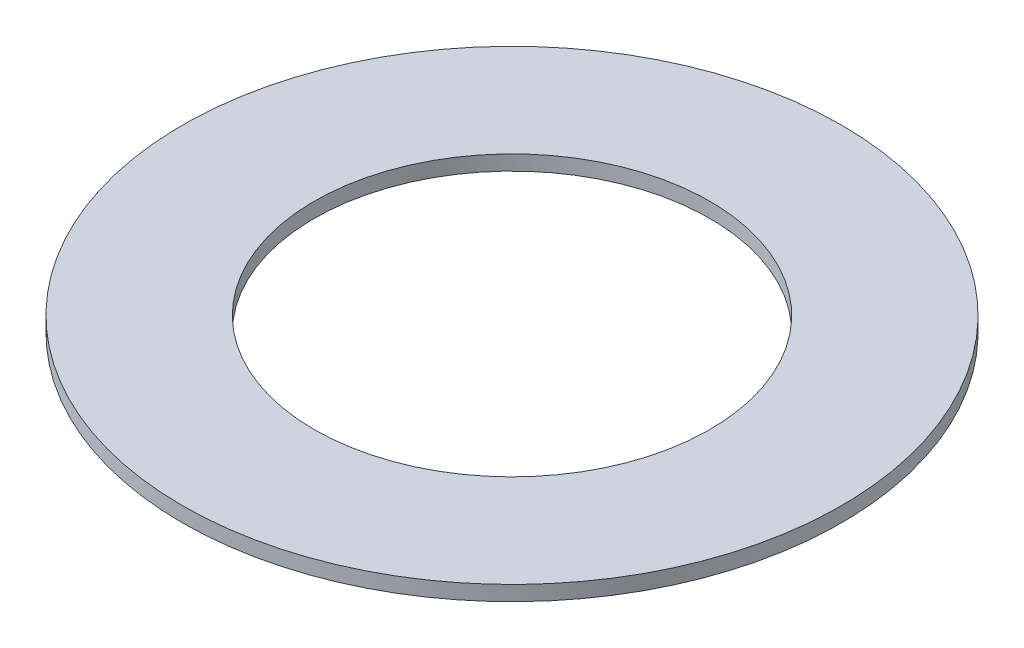
ISO-10303-21;
HEADER;
FILE_DESCRIPTION(('STEP AP214'),'2;1');
FILE_NAME('part.step','',(''),(''),'','','');
FILE_SCHEMA(('AUTOMOTIVE_DESIGN { 1 0 10303 214 1 1 1 1 }'));
ENDSEC;
DATA;
#1=APPLICATION_CONTEXT('core data for automotive mechanical design processes');
#2=APPLICATION_PROTOCOL_DEFINITION('international standard','automotive_design',2000,#1);
#3=PRODUCT_CONTEXT('',#1,'mechanical');
#4=PRODUCT('Part','Part','',(#3));
#5=PRODUCT_RELATED_PRODUCT_CATEGORY('part','',(#4));
#6=PRODUCT_DEFINITION_FORMATION('','',#4);
#7=PRODUCT_DEFINITION_CONTEXT('part definition',#1,'design');
#8=PRODUCT_DEFINITION('design','',#6,#7);
#9=PRODUCT_DEFINITION_SHAPE('','',#8);
#10=(LENGTH_UNIT() NAMED_UNIT(*) SI_UNIT(.MILLI.,.METRE.));
#11=(NAMED_UNIT(*) PLANE_ANGLE_UNIT() SI_UNIT($,.RADIAN.));
#12=(NAMED_UNIT(*) SI_UNIT($,.STERADIAN.) SOLID_ANGLE_UNIT());
#13=UNCERTAINTY_MEASURE_WITH_UNIT(LENGTH_MEASURE(1.E-05),#10,'distance_accuracy_value','');
#14=(GEOMETRIC_REPRESENTATION_CONTEXT(3) GLOBAL_UNCERTAINTY_ASSIGNED_CONTEXT((#13)) GLOBAL_UNIT_ASSIGNED_CONTEXT((#10,
#11,#12)) REPRESENTATION_CONTEXT('',''));
#15=CARTESIAN_POINT('',(0.,0.,0.));
#16=DIRECTION('',(0.,0.,1.));
#17=DIRECTION('',(1.,0.,0.));
#18=AXIS2_PLACEMENT_3D('',#15,#16,#17);
#19=CARTESIAN_POINT('',(0.,3.,0.));
#20=DIRECTION('',(0.,1.,0.));
#21=DIRECTION('',(0.,0.,1.));
#22=AXIS2_PLACEMENT_3D('',#19,#20,#21);
#23=PLANE('',#22);
#24=CARTESIAN_POINT('',(0.,3.,0.));
#25=DIRECTION('',(0.,1.,0.));
#26=DIRECTION('',(0.,0.,1.));
#27=AXIS2_PLACEMENT_3D('',#24,#25,#26);
#28=CIRCLE('',#27,66.2476789870584);
#29=CARTESIAN_POINT('',(0.,3.,66.2476789870584));
#30=VERTEX_POINT('',#29);
#31=EDGE_CURVE('E10',#30,#30,#28,.T.);
#32=ORIENTED_EDGE('',*,*,#31,.T.);
#33=EDGE_LOOP('',(#32));
#34=FACE_BOUND('',#33,.T.);
#35=CARTESIAN_POINT('',(0.,3.,0.));
#36=DIRECTION('',(0.,1.,0.));
#37=DIRECTION('',(0.,0.,1.));
#38=AXIS2_PLACEMENT_3D('',#35,#36,#37);
#39=CIRCLE('',#38,39.7621006177945);
#40=CARTESIAN_POINT('',(0.,3.,39.7621006177945));
#41=VERTEX_POINT('',#40);
#42=EDGE_CURVE('E42',#41,#41,#39,.T.);
#43=ORIENTED_EDGE('',*,*,#42,.F.);
#44=EDGE_LOOP('',(#43));
#45=FACE_BOUND('',#44,.T.);
#46=ADVANCED_FACE('F31',(#34,#45),#23,.T.);
#47=CARTESIAN_POINT('',(0.,0.,0.));
#48=DIRECTION('',(0.,1.,0.));
#49=DIRECTION('',(0.,0.,1.));
#50=AXIS2_PLACEMENT_3D('',#47,#48,#49);
#51=PLANE('',#50);
#52=CARTESIAN_POINT('',(0.,0.,0.));
#53=DIRECTION('',(0.,1.,0.));
#54=DIRECTION('',(0.,0.,1.));
#55=AXIS2_PLACEMENT_3D('',#52,#53,#54);
#56=CIRCLE('',#55,66.2476789870584);
#57=CARTESIAN_POINT('',(0.,0.,66.2476789870584));
#58=VERTEX_POINT('',#57);
#59=EDGE_CURVE('E35',#58,#58,#56,.T.);
#60=ORIENTED_EDGE('',*,*,#59,.F.);
#61=EDGE_LOOP('',(#60));
#62=FACE_BOUND('',#61,.T.);
#63=CARTESIAN_POINT('',(0.,0.,0.));
#64=DIRECTION('',(0.,1.,0.));
#65=DIRECTION('',(0.,0.,1.));
#66=AXIS2_PLACEMENT_3D('',#63,#64,#65);
#67=CIRCLE('',#66,39.7621006177945);
#68=CARTESIAN_POINT('',(0.,0.,39.7621006177945));
#69=VERTEX_POINT('',#68);
#70=EDGE_CURVE('E44',#69,#69,#67,.T.);
#71=ORIENTED_EDGE('',*,*,#70,.T.);
#72=EDGE_LOOP('',(#71));
#73=FACE_BOUND('',#72,.T.);
#74=ADVANCED_FACE('F54',(#62,#73),#51,.F.);
#75=CARTESIAN_POINT('',(0.,3.,0.));
#76=DIRECTION('',(0.,-1.,0.));
#77=DIRECTION('',(0.,0.,-1.));
#78=AXIS2_PLACEMENT_3D('',#75,#76,#77);
#79=CYLINDRICAL_SURFACE('',#78,66.2476789870584);
#80=ORIENTED_EDGE('',*,*,#31,.F.);
#81=EDGE_LOOP('',(#80));
#82=FACE_BOUND('',#81,.T.);
#83=ORIENTED_EDGE('',*,*,#59,.T.);
#84=EDGE_LOOP('',(#83));
#85=FACE_BOUND('',#84,.T.);
#86=ADVANCED_FACE('F33',(#82,#85),#79,.T.);
#87=CARTESIAN_POINT('',(0.,3.,0.));
#88=DIRECTION('',(0.,-1.,0.));
#89=DIRECTION('',(0.,0.,-1.));
#90=AXIS2_PLACEMENT_3D('',#87,#88,#89);
#91=CYLINDRICAL_SURFACE('',#90,39.7621006177945);
#92=ORIENTED_EDGE('',*,*,#42,.T.);
#93=EDGE_LOOP('',(#92));
#94=FACE_BOUND('',#93,.T.);
#95=ORIENTED_EDGE('',*,*,#70,.F.);
#96=EDGE_LOOP('',(#95));
#97=FACE_BOUND('',#96,.T.);
#98=ADVANCED_FACE('F50',(#94,#97),#91,.F.);
#99=CLOSED_SHELL('',(#46,#74,#86,#98));
#100=MANIFOLD_SOLID_BREP('B2',#99);
#101=ADVANCED_BREP_SHAPE_REPRESENTATION('',(#18,#100),#14);
#102=SHAPE_DEFINITION_REPRESENTATION(#9,#101);
ENDSEC;
END-ISO-10303-21;
